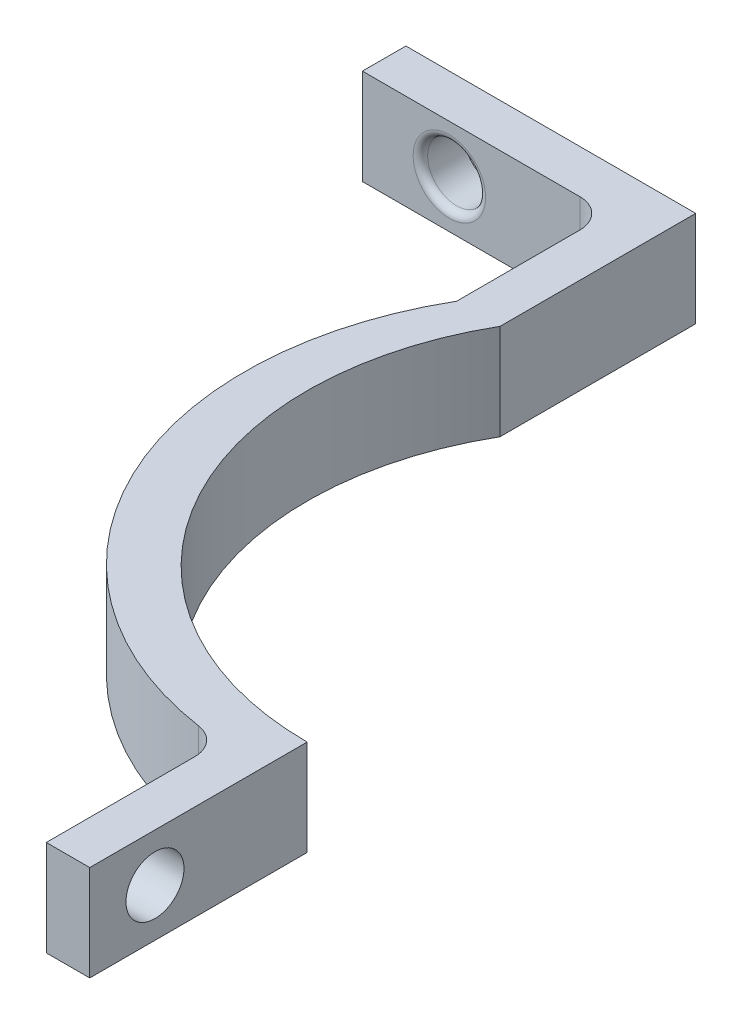
ISO-10303-21;
HEADER;
FILE_DESCRIPTION(('STEP AP214'),'2;1');
FILE_NAME('part.step','',(''),(''),'','','');
FILE_SCHEMA(('AUTOMOTIVE_DESIGN { 1 0 10303 214 1 1 1 1 }'));
ENDSEC;
DATA;
#1=APPLICATION_CONTEXT('core data for automotive mechanical design processes');
#2=APPLICATION_PROTOCOL_DEFINITION('international standard','automotive_design',2000,#1);
#3=PRODUCT_CONTEXT('',#1,'mechanical');
#4=PRODUCT('Part','Part','',(#3));
#5=PRODUCT_RELATED_PRODUCT_CATEGORY('part','',(#4));
#6=PRODUCT_DEFINITION_FORMATION('','',#4);
#7=PRODUCT_DEFINITION_CONTEXT('part definition',#1,'design');
#8=PRODUCT_DEFINITION('design','',#6,#7);
#9=PRODUCT_DEFINITION_SHAPE('','',#8);
#10=(LENGTH_UNIT() NAMED_UNIT(*) SI_UNIT(.MILLI.,.METRE.));
#11=(NAMED_UNIT(*) PLANE_ANGLE_UNIT() SI_UNIT($,.RADIAN.));
#12=(NAMED_UNIT(*) SI_UNIT($,.STERADIAN.) SOLID_ANGLE_UNIT());
#13=UNCERTAINTY_MEASURE_WITH_UNIT(LENGTH_MEASURE(1.E-05),#10,'distance_accuracy_value','');
#14=(GEOMETRIC_REPRESENTATION_CONTEXT(3) GLOBAL_UNCERTAINTY_ASSIGNED_CONTEXT((#13)) GLOBAL_UNIT_ASSIGNED_CONTEXT((#10,
#11,#12)) REPRESENTATION_CONTEXT('',''));
#15=CARTESIAN_POINT('',(0.,0.,0.));
#16=DIRECTION('',(0.,0.,1.));
#17=DIRECTION('',(1.,0.,0.));
#18=AXIS2_PLACEMENT_3D('',#15,#16,#17);
#19=CARTESIAN_POINT('',(0.,6.6,-21.));
#20=DIRECTION('',(0.,-1.,0.));
#21=DIRECTION('',(0.,0.,-1.));
#22=AXIS2_PLACEMENT_3D('',#19,#20,#21);
#23=CYLINDRICAL_SURFACE('',#22,21.);
#24=CARTESIAN_POINT('',(0.,0.,-21.));
#25=DIRECTION('',(0.,1.,0.));
#26=DIRECTION('',(0.,0.,1.));
#27=AXIS2_PLACEMENT_3D('',#24,#25,#26);
#28=CIRCLE('',#27,21.);
#29=CARTESIAN_POINT('',(-18.1865334794732,0.,-31.5));
#30=VERTEX_POINT('',#29);
#31=CARTESIAN_POINT('',(0.,0.,0.));
#32=VERTEX_POINT('',#31);
#33=EDGE_CURVE('E136',#30,#32,#28,.T.);
#34=ORIENTED_EDGE('',*,*,#33,.F.);
#35=DIRECTION('',(0.,-1.,0.));
#36=VECTOR('',#35,1.);
#37=CARTESIAN_POINT('',(-18.1865334794732,6.6,-31.5));
#38=LINE('',#37,#36);
#39=CARTESIAN_POINT('',(-18.1865334794732,6.6,-31.5));
#40=VERTEX_POINT('',#39);
#41=EDGE_CURVE('E130',#40,#30,#38,.T.);
#42=ORIENTED_EDGE('',*,*,#41,.F.);
#43=CARTESIAN_POINT('',(0.,6.6,-21.));
#44=DIRECTION('',(0.,1.,0.));
#45=DIRECTION('',(0.,0.,1.));
#46=AXIS2_PLACEMENT_3D('',#43,#44,#45);
#47=CIRCLE('',#46,21.);
#48=CARTESIAN_POINT('',(0.,6.6,0.));
#49=VERTEX_POINT('',#48);
#50=EDGE_CURVE('E133',#40,#49,#47,.T.);
#51=ORIENTED_EDGE('',*,*,#50,.T.);
#52=DIRECTION('',(0.,-1.,0.));
#53=VECTOR('',#52,1.);
#54=CARTESIAN_POINT('',(0.,6.6,0.));
#55=LINE('',#54,#53);
#56=EDGE_CURVE('E192',#49,#32,#55,.T.);
#57=ORIENTED_EDGE('',*,*,#56,.T.);
#58=EDGE_LOOP('',(#34,#42,#51,#57));
#59=FACE_BOUND('',#58,.T.);
#60=ADVANCED_FACE('F39',(#59),#23,.F.);
#61=CARTESIAN_POINT('',(-18.1865334794732,6.6,0.));
#62=DIRECTION('',(-1.,0.,0.));
#63=DIRECTION('',(0.,0.,1.));
#64=AXIS2_PLACEMENT_3D('',#61,#62,#63);
#65=PLANE('',#64);
#66=DIRECTION('',(0.,0.,-1.));
#67=VECTOR('',#66,1.);
#68=CARTESIAN_POINT('',(-18.1865334794732,0.,0.));
#69=LINE('',#68,#67);
#70=CARTESIAN_POINT('',(-18.1865334794732,0.,-45.));
#71=VERTEX_POINT('',#70);
#72=EDGE_CURVE('E195',#30,#71,#69,.T.);
#73=ORIENTED_EDGE('',*,*,#72,.T.);
#74=DIRECTION('',(0.,-1.,0.));
#75=VECTOR('',#74,1.);
#76=CARTESIAN_POINT('',(-18.1865334794732,6.6,-45.));
#77=LINE('',#76,#75);
#78=CARTESIAN_POINT('',(-18.1865334794732,6.6,-45.));
#79=VERTEX_POINT('',#78);
#80=EDGE_CURVE('E141',#79,#71,#77,.T.);
#81=ORIENTED_EDGE('',*,*,#80,.F.);
#82=DIRECTION('',(0.,0.,-1.));
#83=VECTOR('',#82,1.);
#84=CARTESIAN_POINT('',(-18.1865334794732,6.6,0.));
#85=LINE('',#84,#83);
#86=EDGE_CURVE('E144',#40,#79,#85,.T.);
#87=ORIENTED_EDGE('',*,*,#86,.F.);
#88=ORIENTED_EDGE('',*,*,#41,.T.);
#89=EDGE_LOOP('',(#73,#81,#87,#88));
#90=FACE_BOUND('',#89,.T.);
#91=ADVANCED_FACE('F145',(#90),#65,.F.);
#92=CARTESIAN_POINT('',(0.,6.6,-45.));
#93=DIRECTION('',(0.,0.,1.));
#94=DIRECTION('',(1.,0.,0.));
#95=AXIS2_PLACEMENT_3D('',#92,#93,#94);
#96=PLANE('',#95);
#97=CARTESIAN_POINT('',(-32.1865334794732,3.3,-45.));
#98=DIRECTION('',(0.,0.,1.));
#99=DIRECTION('',(1.,0.,0.));
#100=AXIS2_PLACEMENT_3D('',#97,#98,#99);
#101=CIRCLE('',#100,2.);
#102=CARTESIAN_POINT('',(-30.1865334794732,3.3,-45.));
#103=VERTEX_POINT('',#102);
#104=EDGE_CURVE('E164',#103,#103,#101,.T.);
#105=ORIENTED_EDGE('',*,*,#104,.T.);
#106=EDGE_LOOP('',(#105));
#107=FACE_BOUND('',#106,.T.);
#108=DIRECTION('',(-1.,0.,0.));
#109=VECTOR('',#108,1.);
#110=CARTESIAN_POINT('',(0.,0.,-45.));
#111=LINE('',#110,#109);
#112=CARTESIAN_POINT('',(-38.1865334794732,0.,-45.));
#113=VERTEX_POINT('',#112);
#114=EDGE_CURVE('E198',#71,#113,#111,.T.);
#115=ORIENTED_EDGE('',*,*,#114,.T.);
#116=DIRECTION('',(0.,-1.,0.));
#117=VECTOR('',#116,1.);
#118=CARTESIAN_POINT('',(-38.1865334794732,6.6,-45.));
#119=LINE('',#118,#117);
#120=CARTESIAN_POINT('',(-38.1865334794732,6.6,-45.));
#121=VERTEX_POINT('',#120);
#122=EDGE_CURVE('E236',#121,#113,#119,.T.);
#123=ORIENTED_EDGE('',*,*,#122,.F.);
#124=DIRECTION('',(-1.,0.,0.));
#125=VECTOR('',#124,1.);
#126=CARTESIAN_POINT('',(0.,6.6,-45.));
#127=LINE('',#126,#125);
#128=EDGE_CURVE('E150',#79,#121,#127,.T.);
#129=ORIENTED_EDGE('',*,*,#128,.F.);
#130=ORIENTED_EDGE('',*,*,#80,.T.);
#131=EDGE_LOOP('',(#115,#123,#129,#130));
#132=FACE_BOUND('',#131,.T.);
#133=ADVANCED_FACE('F297',(#107,#132),#96,.F.);
#134=CARTESIAN_POINT('',(-38.1865334794732,6.6,0.));
#135=DIRECTION('',(1.,0.,0.));
#136=DIRECTION('',(0.,0.,-1.));
#137=AXIS2_PLACEMENT_3D('',#134,#135,#136);
#138=PLANE('',#137);
#139=DIRECTION('',(0.,0.,1.));
#140=VECTOR('',#139,1.);
#141=CARTESIAN_POINT('',(-38.1865334794732,0.,0.));
#142=LINE('',#141,#140);
#143=CARTESIAN_POINT('',(-38.1865334794732,0.,-42.));
#144=VERTEX_POINT('',#143);
#145=EDGE_CURVE('E201',#113,#144,#142,.T.);
#146=ORIENTED_EDGE('',*,*,#145,.T.);
#147=DIRECTION('',(0.,-1.,0.));
#148=VECTOR('',#147,1.);
#149=CARTESIAN_POINT('',(-38.1865334794732,6.6,-42.));
#150=LINE('',#149,#148);
#151=CARTESIAN_POINT('',(-38.1865334794732,6.6,-42.));
#152=VERTEX_POINT('',#151);
#153=EDGE_CURVE('E232',#152,#144,#150,.T.);
#154=ORIENTED_EDGE('',*,*,#153,.F.);
#155=DIRECTION('',(0.,0.,1.));
#156=VECTOR('',#155,1.);
#157=CARTESIAN_POINT('',(-38.1865334794732,6.6,0.));
#158=LINE('',#157,#156);
#159=EDGE_CURVE('E169',#121,#152,#158,.T.);
#160=ORIENTED_EDGE('',*,*,#159,.F.);
#161=ORIENTED_EDGE('',*,*,#122,.T.);
#162=EDGE_LOOP('',(#146,#154,#160,#161));
#163=FACE_BOUND('',#162,.T.);
#164=ADVANCED_FACE('F333',(#163),#138,.F.);
#165=CARTESIAN_POINT('',(0.,6.6,-42.));
#166=DIRECTION('',(0.,0.,-1.));
#167=DIRECTION('',(-1.,0.,0.));
#168=AXIS2_PLACEMENT_3D('',#165,#166,#167);
#169=PLANE('',#168);
#170=CARTESIAN_POINT('',(-32.1865334794732,3.3,-42.));
#171=DIRECTION('',(0.,0.,-1.));
#172=DIRECTION('',(-1.,0.,0.));
#173=AXIS2_PLACEMENT_3D('',#170,#171,#172);
#174=CIRCLE('',#173,2.5);
#175=CARTESIAN_POINT('',(-34.6865334794732,3.3,-42.));
#176=VERTEX_POINT('',#175);
#177=EDGE_CURVE('E258',#176,#176,#174,.T.);
#178=ORIENTED_EDGE('',*,*,#177,.T.);
#179=EDGE_LOOP('',(#178));
#180=FACE_BOUND('',#179,.T.);
#181=DIRECTION('',(1.,0.,0.));
#182=VECTOR('',#181,1.);
#183=CARTESIAN_POINT('',(0.,0.,-42.));
#184=LINE('',#183,#182);
#185=CARTESIAN_POINT('',(-23.1865334794732,0.,-42.));
#186=VERTEX_POINT('',#185);
#187=EDGE_CURVE('E204',#144,#186,#184,.T.);
#188=ORIENTED_EDGE('',*,*,#187,.T.);
#189=DIRECTION('',(0.,-1.,0.));
#190=VECTOR('',#189,1.);
#191=CARTESIAN_POINT('',(-23.1865334794732,6.6,-42.));
#192=LINE('',#191,#190);
#193=CARTESIAN_POINT('',(-23.1865334794732,6.6,-42.));
#194=VERTEX_POINT('',#193);
#195=EDGE_CURVE('E245',#186,#194,#192,.F.);
#196=ORIENTED_EDGE('',*,*,#195,.T.);
#197=DIRECTION('',(1.,0.,0.));
#198=VECTOR('',#197,1.);
#199=CARTESIAN_POINT('',(0.,6.6,-42.));
#200=LINE('',#199,#198);
#201=EDGE_CURVE('E172',#152,#194,#200,.T.);
#202=ORIENTED_EDGE('',*,*,#201,.F.);
#203=ORIENTED_EDGE('',*,*,#153,.T.);
#204=EDGE_LOOP('',(#188,#196,#202,#203));
#205=FACE_BOUND('',#204,.T.);
#206=ADVANCED_FACE('F327',(#180,#205),#169,.F.);
#207=CARTESIAN_POINT('',(-21.1865334794732,6.6,0.));
#208=DIRECTION('',(1.,0.,0.));
#209=DIRECTION('',(0.,0.,-1.));
#210=AXIS2_PLACEMENT_3D('',#207,#208,#209);
#211=PLANE('',#210);
#212=DIRECTION('',(0.,0.,1.));
#213=VECTOR('',#212,1.);
#214=CARTESIAN_POINT('',(-21.1865334794732,6.6,0.));
#215=LINE('',#214,#213);
#216=CARTESIAN_POINT('',(-21.1865334794732,6.6,-40.));
#217=VERTEX_POINT('',#216);
#218=CARTESIAN_POINT('',(-21.1865334794732,6.6,-31.5));
#219=VERTEX_POINT('',#218);
#220=EDGE_CURVE('E176',#217,#219,#215,.T.);
#221=ORIENTED_EDGE('',*,*,#220,.F.);
#222=DIRECTION('',(0.,-1.,0.));
#223=VECTOR('',#222,1.);
#224=CARTESIAN_POINT('',(-21.1865334794732,0.,-40.));
#225=LINE('',#224,#223);
#226=CARTESIAN_POINT('',(-21.1865334794732,0.,-40.));
#227=VERTEX_POINT('',#226);
#228=EDGE_CURVE('E140',#217,#227,#225,.T.);
#229=ORIENTED_EDGE('',*,*,#228,.T.);
#230=DIRECTION('',(0.,0.,1.));
#231=VECTOR('',#230,1.);
#232=CARTESIAN_POINT('',(-21.1865334794732,0.,0.));
#233=LINE('',#232,#231);
#234=CARTESIAN_POINT('',(-21.1865334794732,0.,-31.5));
#235=VERTEX_POINT('',#234);
#236=EDGE_CURVE('E208',#227,#235,#233,.T.);
#237=ORIENTED_EDGE('',*,*,#236,.T.);
#238=DIRECTION('',(0.,-1.,0.));
#239=VECTOR('',#238,1.);
#240=CARTESIAN_POINT('',(-21.1865334794732,6.6,-31.5));
#241=LINE('',#240,#239);
#242=EDGE_CURVE('E228',#219,#235,#241,.T.);
#243=ORIENTED_EDGE('',*,*,#242,.F.);
#244=EDGE_LOOP('',(#221,#229,#237,#243));
#245=FACE_BOUND('',#244,.T.);
#246=ADVANCED_FACE('F316',(#245),#211,.F.);
#247=CARTESIAN_POINT('',(-1.28885867941073,6.6,-19.9638595036746));
#248=DIRECTION('',(0.,-1.,0.));
#249=DIRECTION('',(0.,0.,-1.));
#250=AXIS2_PLACEMENT_3D('',#247,#248,#249);
#251=CYLINDRICAL_SURFACE('',#250,23.);
#252=CARTESIAN_POINT('',(-1.28885867941073,0.,-19.9638595036746));
#253=DIRECTION('',(0.,1.,0.));
#254=DIRECTION('',(0.,0.,1.));
#255=AXIS2_PLACEMENT_3D('',#252,#253,#254);
#256=CIRCLE('',#255,23.);
#257=CARTESIAN_POINT('',(-4.70310869435286,0.,2.78131354107197));
#258=VERTEX_POINT('',#257);
#259=EDGE_CURVE('E211',#235,#258,#256,.T.);
#260=ORIENTED_EDGE('',*,*,#259,.T.);
#261=DIRECTION('',(0.,-1.,0.));
#262=VECTOR('',#261,1.);
#263=CARTESIAN_POINT('',(-4.70310869435286,6.6,2.78131354107197));
#264=LINE('',#263,#262);
#265=CARTESIAN_POINT('',(-4.70310869435286,6.6,2.78131354107197));
#266=VERTEX_POINT('',#265);
#267=EDGE_CURVE('E56',#258,#266,#264,.F.);
#268=ORIENTED_EDGE('',*,*,#267,.T.);
#269=CARTESIAN_POINT('',(-1.28885867941073,6.6,-19.9638595036746));
#270=DIRECTION('',(0.,1.,0.));
#271=DIRECTION('',(0.,0.,1.));
#272=AXIS2_PLACEMENT_3D('',#269,#270,#271);
#273=CIRCLE('',#272,23.);
#274=EDGE_CURVE('E179',#219,#266,#273,.T.);
#275=ORIENTED_EDGE('',*,*,#274,.F.);
#276=ORIENTED_EDGE('',*,*,#242,.T.);
#277=EDGE_LOOP('',(#260,#268,#275,#276));
#278=FACE_BOUND('',#277,.T.);
#279=ADVANCED_FACE('F318',(#278),#251,.T.);
#280=CARTESIAN_POINT('',(-3.,6.6,0.));
#281=DIRECTION('',(-1.,0.,0.));
#282=DIRECTION('',(0.,0.,1.));
#283=AXIS2_PLACEMENT_3D('',#280,#281,#282);
#284=PLANE('',#283);
#285=CARTESIAN_POINT('',(-3.,3.3,10.5));
#286=DIRECTION('',(-1.,0.,0.));
#287=DIRECTION('',(0.,0.,1.));
#288=AXIS2_PLACEMENT_3D('',#285,#286,#287);
#289=CIRCLE('',#288,2.);
#290=CARTESIAN_POINT('',(-3.,3.3,12.5));
#291=VERTEX_POINT('',#290);
#292=EDGE_CURVE('E471',#291,#291,#289,.T.);
#293=ORIENTED_EDGE('',*,*,#292,.F.);
#294=EDGE_LOOP('',(#293));
#295=FACE_BOUND('',#294,.T.);
#296=DIRECTION('',(0.,0.,-1.));
#297=VECTOR('',#296,1.);
#298=CARTESIAN_POINT('',(-3.,6.6,0.));
#299=LINE('',#298,#297);
#300=CARTESIAN_POINT('',(-3.,6.6,15.));
#301=VERTEX_POINT('',#300);
#302=CARTESIAN_POINT('',(-3.,6.6,4.75915467539777));
#303=VERTEX_POINT('',#302);
#304=EDGE_CURVE('E182',#301,#303,#299,.T.);
#305=ORIENTED_EDGE('',*,*,#304,.T.);
#306=DIRECTION('',(0.,-1.,0.));
#307=VECTOR('',#306,1.);
#308=CARTESIAN_POINT('',(-3.,6.6,4.75915467539777));
#309=LINE('',#308,#307);
#310=CARTESIAN_POINT('',(-3.,0.,4.75915467539777));
#311=VERTEX_POINT('',#310);
#312=EDGE_CURVE('E262',#303,#311,#309,.T.);
#313=ORIENTED_EDGE('',*,*,#312,.T.);
#314=DIRECTION('',(0.,0.,-1.));
#315=VECTOR('',#314,1.);
#316=CARTESIAN_POINT('',(-3.,0.,0.));
#317=LINE('',#316,#315);
#318=CARTESIAN_POINT('',(-3.,0.,15.));
#319=VERTEX_POINT('',#318);
#320=EDGE_CURVE('E214',#319,#311,#317,.T.);
#321=ORIENTED_EDGE('',*,*,#320,.F.);
#322=DIRECTION('',(0.,-1.,0.));
#323=VECTOR('',#322,1.);
#324=CARTESIAN_POINT('',(-3.,6.6,15.));
#325=LINE('',#324,#323);
#326=EDGE_CURVE('E225',#301,#319,#325,.T.);
#327=ORIENTED_EDGE('',*,*,#326,.F.);
#328=EDGE_LOOP('',(#305,#313,#321,#327));
#329=FACE_BOUND('',#328,.T.);
#330=ADVANCED_FACE('F272',(#295,#329),#284,.T.);
#331=CARTESIAN_POINT('',(0.,6.6,15.));
#332=DIRECTION('',(0.,0.,1.));
#333=DIRECTION('',(1.,0.,0.));
#334=AXIS2_PLACEMENT_3D('',#331,#332,#333);
#335=PLANE('',#334);
#336=DIRECTION('',(-1.,0.,0.));
#337=VECTOR('',#336,1.);
#338=CARTESIAN_POINT('',(0.,0.,15.));
#339=LINE('',#338,#337);
#340=CARTESIAN_POINT('',(0.,0.,15.));
#341=VERTEX_POINT('',#340);
#342=EDGE_CURVE('E161',#341,#319,#339,.T.);
#343=ORIENTED_EDGE('',*,*,#342,.F.);
#344=DIRECTION('',(0.,-1.,0.));
#345=VECTOR('',#344,1.);
#346=CARTESIAN_POINT('',(0.,6.6,15.));
#347=LINE('',#346,#345);
#348=CARTESIAN_POINT('',(0.,6.6,15.));
#349=VERTEX_POINT('',#348);
#350=EDGE_CURVE('E222',#349,#341,#347,.T.);
#351=ORIENTED_EDGE('',*,*,#350,.F.);
#352=DIRECTION('',(-1.,0.,0.));
#353=VECTOR('',#352,1.);
#354=CARTESIAN_POINT('',(0.,6.6,15.));
#355=LINE('',#354,#353);
#356=EDGE_CURVE('E186',#349,#301,#355,.T.);
#357=ORIENTED_EDGE('',*,*,#356,.T.);
#358=ORIENTED_EDGE('',*,*,#326,.T.);
#359=EDGE_LOOP('',(#343,#351,#357,#358));
#360=FACE_BOUND('',#359,.T.);
#361=ADVANCED_FACE('F280',(#360),#335,.T.);
#362=CARTESIAN_POINT('',(0.,6.6,0.));
#363=DIRECTION('',(1.,0.,0.));
#364=DIRECTION('',(0.,0.,-1.));
#365=AXIS2_PLACEMENT_3D('',#362,#363,#364);
#366=PLANE('',#365);
#367=CARTESIAN_POINT('',(0.,3.3,10.5));
#368=DIRECTION('',(1.,0.,0.));
#369=DIRECTION('',(0.,0.,-1.));
#370=AXIS2_PLACEMENT_3D('',#367,#368,#369);
#371=CIRCLE('',#370,2.);
#372=CARTESIAN_POINT('',(0.,3.3,8.5));
#373=VERTEX_POINT('',#372);
#374=EDGE_CURVE('E43',#373,#373,#371,.T.);
#375=ORIENTED_EDGE('',*,*,#374,.F.);
#376=EDGE_LOOP('',(#375));
#377=FACE_BOUND('',#376,.T.);
#378=DIRECTION('',(0.,0.,1.));
#379=VECTOR('',#378,1.);
#380=CARTESIAN_POINT('',(0.,0.,0.));
#381=LINE('',#380,#379);
#382=EDGE_CURVE('E157',#32,#341,#381,.T.);
#383=ORIENTED_EDGE('',*,*,#382,.F.);
#384=ORIENTED_EDGE('',*,*,#56,.F.);
#385=DIRECTION('',(0.,0.,1.));
#386=VECTOR('',#385,1.);
#387=CARTESIAN_POINT('',(0.,6.6,0.));
#388=LINE('',#387,#386);
#389=EDGE_CURVE('E155',#49,#349,#388,.T.);
#390=ORIENTED_EDGE('',*,*,#389,.T.);
#391=ORIENTED_EDGE('',*,*,#350,.T.);
#392=EDGE_LOOP('',(#383,#384,#390,#391));
#393=FACE_BOUND('',#392,.T.);
#394=ADVANCED_FACE('F352',(#377,#393),#366,.T.);
#395=CARTESIAN_POINT('',(0.,6.6,0.));
#396=DIRECTION('',(0.,1.,0.));
#397=DIRECTION('',(0.,0.,1.));
#398=AXIS2_PLACEMENT_3D('',#395,#396,#397);
#399=PLANE('',#398);
#400=ORIENTED_EDGE('',*,*,#50,.F.);
#401=ORIENTED_EDGE('',*,*,#86,.T.);
#402=ORIENTED_EDGE('',*,*,#128,.T.);
#403=ORIENTED_EDGE('',*,*,#159,.T.);
#404=ORIENTED_EDGE('',*,*,#201,.T.);
#405=CARTESIAN_POINT('',(-23.1865334794732,6.6,-40.));
#406=DIRECTION('',(0.,1.,0.));
#407=DIRECTION('',(0.,0.,1.));
#408=AXIS2_PLACEMENT_3D('',#405,#406,#407);
#409=CIRCLE('',#408,2.);
#410=EDGE_CURVE('E251',#194,#217,#409,.F.);
#411=ORIENTED_EDGE('',*,*,#410,.T.);
#412=ORIENTED_EDGE('',*,*,#220,.T.);
#413=ORIENTED_EDGE('',*,*,#274,.T.);
#414=CARTESIAN_POINT('',(-5.,6.6,4.75915467539777));
#415=DIRECTION('',(0.,1.,0.));
#416=DIRECTION('',(0.,0.,1.));
#417=AXIS2_PLACEMENT_3D('',#414,#415,#416);
#418=CIRCLE('',#417,2.);
#419=EDGE_CURVE('E11',#266,#303,#418,.F.);
#420=ORIENTED_EDGE('',*,*,#419,.T.);
#421=ORIENTED_EDGE('',*,*,#304,.F.);
#422=ORIENTED_EDGE('',*,*,#356,.F.);
#423=ORIENTED_EDGE('',*,*,#389,.F.);
#424=EDGE_LOOP('',(#400,#401,#402,#403,#404,#411,#412,#413,#420,#421,#422,#423));
#425=FACE_BOUND('',#424,.T.);
#426=ADVANCED_FACE('F152',(#425),#399,.T.);
#427=CARTESIAN_POINT('',(0.,0.,0.));
#428=DIRECTION('',(0.,1.,0.));
#429=DIRECTION('',(0.,0.,1.));
#430=AXIS2_PLACEMENT_3D('',#427,#428,#429);
#431=PLANE('',#430);
#432=ORIENTED_EDGE('',*,*,#33,.T.);
#433=ORIENTED_EDGE('',*,*,#382,.T.);
#434=ORIENTED_EDGE('',*,*,#342,.T.);
#435=ORIENTED_EDGE('',*,*,#320,.T.);
#436=CARTESIAN_POINT('',(-5.,0.,4.75915467539777));
#437=DIRECTION('',(0.,1.,0.));
#438=DIRECTION('',(0.,0.,1.));
#439=AXIS2_PLACEMENT_3D('',#436,#437,#438);
#440=CIRCLE('',#439,2.);
#441=EDGE_CURVE('E49',#311,#258,#440,.T.);
#442=ORIENTED_EDGE('',*,*,#441,.T.);
#443=ORIENTED_EDGE('',*,*,#259,.F.);
#444=ORIENTED_EDGE('',*,*,#236,.F.);
#445=CARTESIAN_POINT('',(-23.1865334794732,0.,-40.));
#446=DIRECTION('',(0.,1.,0.));
#447=DIRECTION('',(0.,0.,1.));
#448=AXIS2_PLACEMENT_3D('',#445,#446,#447);
#449=CIRCLE('',#448,2.);
#450=EDGE_CURVE('E248',#227,#186,#449,.T.);
#451=ORIENTED_EDGE('',*,*,#450,.T.);
#452=ORIENTED_EDGE('',*,*,#187,.F.);
#453=ORIENTED_EDGE('',*,*,#145,.F.);
#454=ORIENTED_EDGE('',*,*,#114,.F.);
#455=ORIENTED_EDGE('',*,*,#72,.F.);
#456=EDGE_LOOP('',(#432,#433,#434,#435,#442,#443,#444,#451,#452,#453,#454,#455));
#457=FACE_BOUND('',#456,.T.);
#458=ADVANCED_FACE('F276',(#457),#431,.F.);
#459=CARTESIAN_POINT('',(-32.1865334794732,3.3,-48.6));
#460=DIRECTION('',(0.,0.,1.));
#461=DIRECTION('',(1.,0.,0.));
#462=AXIS2_PLACEMENT_3D('',#459,#460,#461);
#463=CYLINDRICAL_SURFACE('',#462,2.);
#464=CARTESIAN_POINT('',(-32.1865334794732,3.3,-42.5));
#465=DIRECTION('',(0.,0.,-1.));
#466=DIRECTION('',(-1.,0.,0.));
#467=AXIS2_PLACEMENT_3D('',#464,#465,#466);
#468=CIRCLE('',#467,2.);
#469=CARTESIAN_POINT('',(-34.1865334794732,3.3,-42.5));
#470=VERTEX_POINT('',#469);
#471=EDGE_CURVE('E254',#470,#470,#468,.F.);
#472=ORIENTED_EDGE('',*,*,#471,.T.);
#473=EDGE_LOOP('',(#472));
#474=FACE_BOUND('',#473,.T.);
#475=ORIENTED_EDGE('',*,*,#104,.F.);
#476=EDGE_LOOP('',(#475));
#477=FACE_BOUND('',#476,.T.);
#478=ADVANCED_FACE('F302',(#474,#477),#463,.F.);
#479=CARTESIAN_POINT('',(-23.1865334794732,6.6,-40.));
#480=DIRECTION('',(0.,1.,0.));
#481=DIRECTION('',(0.,0.,1.));
#482=AXIS2_PLACEMENT_3D('',#479,#480,#481);
#483=CYLINDRICAL_SURFACE('',#482,2.);
#484=ORIENTED_EDGE('',*,*,#410,.F.);
#485=ORIENTED_EDGE('',*,*,#195,.F.);
#486=ORIENTED_EDGE('',*,*,#450,.F.);
#487=ORIENTED_EDGE('',*,*,#228,.F.);
#488=EDGE_LOOP('',(#484,#485,#486,#487));
#489=FACE_BOUND('',#488,.T.);
#490=ADVANCED_FACE('F290',(#489),#483,.F.);
#491=CARTESIAN_POINT('',(-32.1865334794732,3.3,-42.5));
#492=DIRECTION('',(0.,0.,-1.));
#493=DIRECTION('',(-1.,0.,0.));
#494=AXIS2_PLACEMENT_3D('',#491,#492,#493);
#495=TOROIDAL_SURFACE('',#494,2.5,0.5);
#496=ORIENTED_EDGE('',*,*,#177,.F.);
#497=EDGE_LOOP('',(#496));
#498=FACE_BOUND('',#497,.T.);
#499=ORIENTED_EDGE('',*,*,#471,.F.);
#500=EDGE_LOOP('',(#499));
#501=FACE_BOUND('',#500,.T.);
#502=ADVANCED_FACE('F283',(#498,#501),#495,.T.);
#503=CARTESIAN_POINT('',(-5.,6.6,4.75915467539777));
#504=DIRECTION('',(0.,-1.,0.));
#505=DIRECTION('',(0.,0.,-1.));
#506=AXIS2_PLACEMENT_3D('',#503,#504,#505);
#507=CYLINDRICAL_SURFACE('',#506,2.);
#508=ORIENTED_EDGE('',*,*,#419,.F.);
#509=ORIENTED_EDGE('',*,*,#267,.F.);
#510=ORIENTED_EDGE('',*,*,#441,.F.);
#511=ORIENTED_EDGE('',*,*,#312,.F.);
#512=EDGE_LOOP('',(#508,#509,#510,#511));
#513=FACE_BOUND('',#512,.T.);
#514=ADVANCED_FACE('F41',(#513),#507,.F.);
#515=CARTESIAN_POINT('',(3.6,3.3,10.5));
#516=DIRECTION('',(-1.,0.,0.));
#517=DIRECTION('',(0.,0.,1.));
#518=AXIS2_PLACEMENT_3D('',#515,#516,#517);
#519=CYLINDRICAL_SURFACE('',#518,2.);
#520=ORIENTED_EDGE('',*,*,#374,.T.);
#521=EDGE_LOOP('',(#520));
#522=FACE_BOUND('',#521,.T.);
#523=ORIENTED_EDGE('',*,*,#292,.T.);
#524=EDGE_LOOP('',(#523));
#525=FACE_BOUND('',#524,.T.);
#526=ADVANCED_FACE('F282',(#522,#525),#519,.F.);
#527=CLOSED_SHELL('',(#60,#91,#133,#164,#206,#246,#279,#330,#361,#394,#426,#458,#478,#490,#502,
#514,#526));
#528=MANIFOLD_SOLID_BREP('B2',#527);
#529=ADVANCED_BREP_SHAPE_REPRESENTATION('',(#18,#528),#14);
#530=SHAPE_DEFINITION_REPRESENTATION(#9,#529);
ENDSEC;
END-ISO-10303-21;
